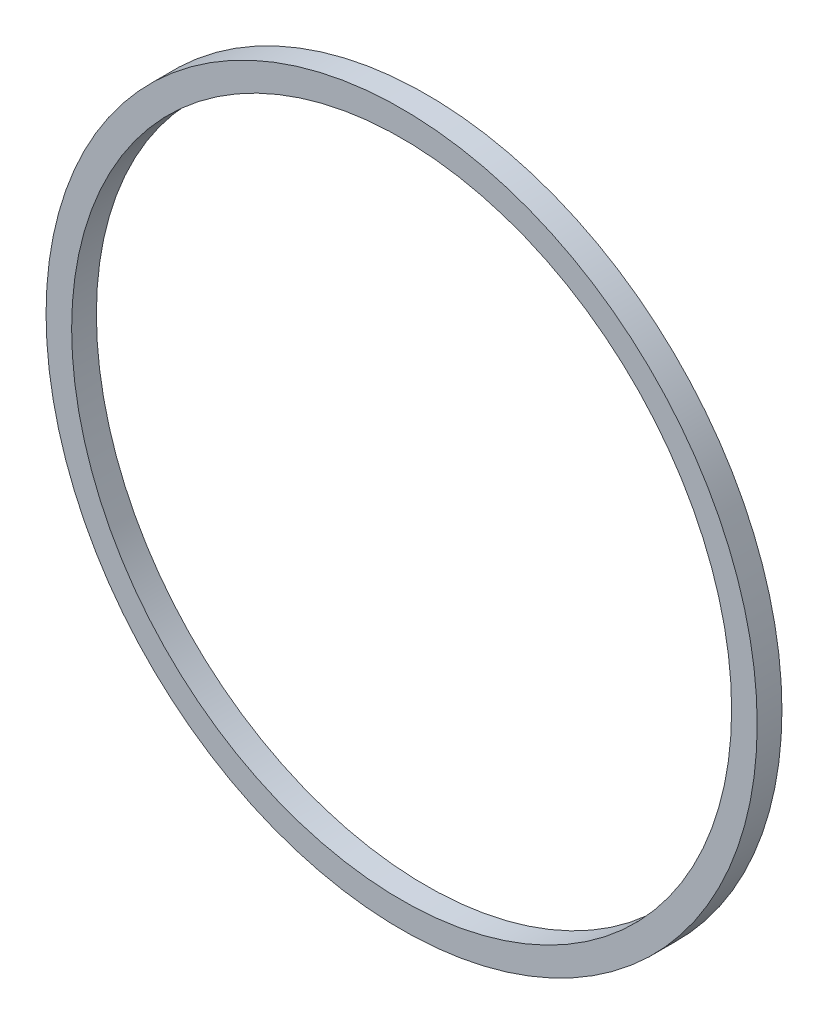
ISO-10303-21;
HEADER;
FILE_DESCRIPTION(('STEP AP214'),'2;1');
FILE_NAME('part.step','',(''),(''),'','','');
FILE_SCHEMA(('AUTOMOTIVE_DESIGN { 1 0 10303 214 1 1 1 1 }'));
ENDSEC;
DATA;
#1=APPLICATION_CONTEXT('core data for automotive mechanical design processes');
#2=APPLICATION_PROTOCOL_DEFINITION('international standard','automotive_design',2000,#1);
#3=PRODUCT_CONTEXT('',#1,'mechanical');
#4=PRODUCT('Part','Part','',(#3));
#5=PRODUCT_RELATED_PRODUCT_CATEGORY('part','',(#4));
#6=PRODUCT_DEFINITION_FORMATION('','',#4);
#7=PRODUCT_DEFINITION_CONTEXT('part definition',#1,'design');
#8=PRODUCT_DEFINITION('design','',#6,#7);
#9=PRODUCT_DEFINITION_SHAPE('','',#8);
#10=(LENGTH_UNIT() NAMED_UNIT(*) SI_UNIT(.MILLI.,.METRE.));
#11=(NAMED_UNIT(*) PLANE_ANGLE_UNIT() SI_UNIT($,.RADIAN.));
#12=(NAMED_UNIT(*) SI_UNIT($,.STERADIAN.) SOLID_ANGLE_UNIT());
#13=UNCERTAINTY_MEASURE_WITH_UNIT(LENGTH_MEASURE(1.E-05),#10,'distance_accuracy_value','');
#14=(GEOMETRIC_REPRESENTATION_CONTEXT(3) GLOBAL_UNCERTAINTY_ASSIGNED_CONTEXT((#13)) GLOBAL_UNIT_ASSIGNED_CONTEXT((#10,
#11,#12)) REPRESENTATION_CONTEXT('',''));
#15=CARTESIAN_POINT('',(0.,0.,0.));
#16=DIRECTION('',(0.,0.,1.));
#17=DIRECTION('',(1.,0.,0.));
#18=AXIS2_PLACEMENT_3D('',#15,#16,#17);
#19=CARTESIAN_POINT('',(0.,0.,76.2));
#20=DIRECTION('',(0.,0.,1.));
#21=DIRECTION('',(1.,0.,0.));
#22=AXIS2_PLACEMENT_3D('',#19,#20,#21);
#23=PLANE('',#22);
#24=CARTESIAN_POINT('',(0.,0.,76.2));
#25=DIRECTION('',(0.,0.,1.));
#26=DIRECTION('',(1.,0.,0.));
#27=AXIS2_PLACEMENT_3D('',#24,#25,#26);
#28=CIRCLE('',#27,1094.74);
#29=CARTESIAN_POINT('',(-1094.74,0.,76.2));
#30=VERTEX_POINT('',#29);
#31=EDGE_CURVE('E11',#30,#30,#28,.T.);
#32=ORIENTED_EDGE('',*,*,#31,.T.);
#33=EDGE_LOOP('',(#32));
#34=FACE_BOUND('',#33,.T.);
#35=CARTESIAN_POINT('',(0.,0.,76.2));
#36=DIRECTION('',(0.,0.,1.));
#37=DIRECTION('',(1.,0.,0.));
#38=AXIS2_PLACEMENT_3D('',#35,#36,#37);
#39=CIRCLE('',#38,1016.);
#40=CARTESIAN_POINT('',(-1016.,0.,76.2));
#41=VERTEX_POINT('',#40);
#42=EDGE_CURVE('E62',#41,#41,#39,.T.);
#43=ORIENTED_EDGE('',*,*,#42,.F.);
#44=EDGE_LOOP('',(#43));
#45=FACE_BOUND('',#44,.T.);
#46=ADVANCED_FACE('F47',(#34,#45),#23,.T.);
#47=CARTESIAN_POINT('',(0.,0.,0.));
#48=DIRECTION('',(0.,0.,1.));
#49=DIRECTION('',(1.,0.,0.));
#50=AXIS2_PLACEMENT_3D('',#47,#48,#49);
#51=PLANE('',#50);
#52=CARTESIAN_POINT('',(0.,0.,0.));
#53=DIRECTION('',(0.,0.,1.));
#54=DIRECTION('',(1.,0.,0.));
#55=AXIS2_PLACEMENT_3D('',#52,#53,#54);
#56=CIRCLE('',#55,1094.74);
#57=CARTESIAN_POINT('',(-1094.74,0.,0.));
#58=VERTEX_POINT('',#57);
#59=EDGE_CURVE('E52',#58,#58,#56,.T.);
#60=ORIENTED_EDGE('',*,*,#59,.F.);
#61=EDGE_LOOP('',(#60));
#62=FACE_BOUND('',#61,.T.);
#63=CARTESIAN_POINT('',(0.,0.,0.));
#64=DIRECTION('',(0.,0.,1.));
#65=DIRECTION('',(1.,0.,0.));
#66=AXIS2_PLACEMENT_3D('',#63,#64,#65);
#67=CIRCLE('',#66,1016.);
#68=CARTESIAN_POINT('',(-1016.,0.,0.));
#69=VERTEX_POINT('',#68);
#70=EDGE_CURVE('E63',#69,#69,#67,.T.);
#71=ORIENTED_EDGE('',*,*,#70,.T.);
#72=EDGE_LOOP('',(#71));
#73=FACE_BOUND('',#72,.T.);
#74=ADVANCED_FACE('F78',(#62,#73),#51,.F.);
#75=CARTESIAN_POINT('',(0.,0.,76.2));
#76=DIRECTION('',(0.,0.,-1.));
#77=DIRECTION('',(-1.,0.,0.));
#78=AXIS2_PLACEMENT_3D('',#75,#76,#77);
#79=CYLINDRICAL_SURFACE('',#78,1094.74);
#80=CARTESIAN_POINT('',(-1094.74,0.,76.2));
#81=CARTESIAN_POINT('',(-1094.74,0.,75.40625));
#82=CARTESIAN_POINT('',(-1094.74,0.,74.6125));
#83=CARTESIAN_POINT('',(-1094.74,0.,73.025));
#84=CARTESIAN_POINT('',(-1094.74,0.,72.23125));
#85=CARTESIAN_POINT('',(-1094.74,0.,70.64375));
#86=CARTESIAN_POINT('',(-1094.74,0.,69.85));
#87=CARTESIAN_POINT('',(-1094.74,0.,68.2625));
#88=CARTESIAN_POINT('',(-1094.74,0.,67.46875));
#89=CARTESIAN_POINT('',(-1094.74,0.,65.88125));
#90=CARTESIAN_POINT('',(-1094.74,0.,65.0875));
#91=CARTESIAN_POINT('',(-1094.74,0.,63.5));
#92=CARTESIAN_POINT('',(-1094.74,0.,62.70625));
#93=CARTESIAN_POINT('',(-1094.74,0.,61.11875));
#94=CARTESIAN_POINT('',(-1094.74,0.,60.325));
#95=CARTESIAN_POINT('',(-1094.74,0.,58.7375));
#96=CARTESIAN_POINT('',(-1094.74,0.,57.94375));
#97=CARTESIAN_POINT('',(-1094.74,0.,56.35625));
#98=CARTESIAN_POINT('',(-1094.74,0.,55.5625));
#99=CARTESIAN_POINT('',(-1094.74,0.,53.975));
#100=CARTESIAN_POINT('',(-1094.74,0.,53.18125));
#101=CARTESIAN_POINT('',(-1094.74,0.,51.59375));
#102=CARTESIAN_POINT('',(-1094.74,0.,50.8));
#103=CARTESIAN_POINT('',(-1094.74,0.,49.2125));
#104=CARTESIAN_POINT('',(-1094.74,0.,48.41875));
#105=CARTESIAN_POINT('',(-1094.74,0.,46.83125));
#106=CARTESIAN_POINT('',(-1094.74,0.,46.0375));
#107=CARTESIAN_POINT('',(-1094.74,0.,44.45));
#108=CARTESIAN_POINT('',(-1094.74,0.,43.65625));
#109=CARTESIAN_POINT('',(-1094.74,0.,42.06875));
#110=CARTESIAN_POINT('',(-1094.74,0.,41.275));
#111=CARTESIAN_POINT('',(-1094.74,0.,39.6875));
#112=CARTESIAN_POINT('',(-1094.74,0.,38.89375));
#113=CARTESIAN_POINT('',(-1094.74,0.,37.30625));
#114=CARTESIAN_POINT('',(-1094.74,0.,36.5125));
#115=CARTESIAN_POINT('',(-1094.74,0.,34.925));
#116=CARTESIAN_POINT('',(-1094.74,0.,34.13125));
#117=CARTESIAN_POINT('',(-1094.74,0.,32.54375));
#118=CARTESIAN_POINT('',(-1094.74,0.,31.75));
#119=CARTESIAN_POINT('',(-1094.74,0.,30.1625));
#120=CARTESIAN_POINT('',(-1094.74,0.,29.36875));
#121=CARTESIAN_POINT('',(-1094.74,0.,27.78125));
#122=CARTESIAN_POINT('',(-1094.74,0.,26.9875));
#123=CARTESIAN_POINT('',(-1094.74,0.,25.4));
#124=CARTESIAN_POINT('',(-1094.74,0.,24.60625));
#125=CARTESIAN_POINT('',(-1094.74,0.,23.01875));
#126=CARTESIAN_POINT('',(-1094.74,0.,22.225));
#127=CARTESIAN_POINT('',(-1094.74,0.,20.6375));
#128=CARTESIAN_POINT('',(-1094.74,0.,19.84375));
#129=CARTESIAN_POINT('',(-1094.74,0.,18.25625));
#130=CARTESIAN_POINT('',(-1094.74,0.,17.4625));
#131=CARTESIAN_POINT('',(-1094.74,0.,15.875));
#132=CARTESIAN_POINT('',(-1094.74,0.,15.08125));
#133=CARTESIAN_POINT('',(-1094.74,0.,13.49375));
#134=CARTESIAN_POINT('',(-1094.74,0.,12.7));
#135=CARTESIAN_POINT('',(-1094.74,0.,11.1125));
#136=CARTESIAN_POINT('',(-1094.74,0.,10.31875));
#137=CARTESIAN_POINT('',(-1094.74,0.,8.73125));
#138=CARTESIAN_POINT('',(-1094.74,0.,7.93750000000001));
#139=CARTESIAN_POINT('',(-1094.74,0.,6.35));
#140=CARTESIAN_POINT('',(-1094.74,0.,5.55625));
#141=CARTESIAN_POINT('',(-1094.74,0.,3.96875));
#142=CARTESIAN_POINT('',(-1094.74,0.,3.175));
#143=CARTESIAN_POINT('',(-1094.74,0.,1.5875));
#144=CARTESIAN_POINT('',(-1094.74,0.,0.793750000000001));
#145=CARTESIAN_POINT('',(-1094.74,0.,0.));
#146=B_SPLINE_CURVE_WITH_KNOTS('',3,(#80,#81,#82,#83,#84,#85,#86,#87,#88,#89,#90,#91,#92,#93,
#94,#95,#96,#97,#98,#99,#100,#101,#102,#103,#104,#105,#106,#107,#108,#109,#110,#111,#112,#113,
#114,#115,#116,#117,#118,#119,#120,#121,#122,#123,#124,#125,#126,#127,#128,#129,#130,#131,#132,
#133,#134,#135,#136,#137,#138,#139,#140,#141,#142,#143,#144,#145),.UNSPECIFIED.,.F.,.F.,(4,2,2,
2,2,2,2,2,2,2,2,2,2,2,2,2,2,2,2,2,2,2,2,2,2,2,2,2,2,2,2,2,4),(0.,2.38125,4.7625,7.14375,
9.52500000000001,11.90625,14.2875,16.66875,19.05,21.43125,23.8125,26.19375,28.575,30.95625,
33.3375,35.71875,38.1,40.48125,42.8625,45.24375,47.625,50.00625,52.3875,54.76875,57.15,59.53125,
61.9125,64.29375,66.675,69.05625,71.4375,73.81875,76.2),.UNSPECIFIED.);
#147=EDGE_CURVE('BSEAM51',#30,#58,#146,.T.);
#148=ORIENTED_EDGE('',*,*,#31,.F.);
#149=ORIENTED_EDGE('',*,*,#59,.T.);
#150=ORIENTED_EDGE('',*,*,#147,.T.);
#151=ORIENTED_EDGE('',*,*,#147,.F.);
#152=EDGE_LOOP('',(#148,#150,#149,#151));
#153=FACE_BOUND('',#152,.T.);
#154=ADVANCED_FACE('F51',(#153),#79,.T.);
#155=CARTESIAN_POINT('',(0.,0.,76.2));
#156=DIRECTION('',(0.,0.,-1.));
#157=DIRECTION('',(-1.,0.,0.));
#158=AXIS2_PLACEMENT_3D('',#155,#156,#157);
#159=CYLINDRICAL_SURFACE('',#158,1016.);
#160=CARTESIAN_POINT('',(-1016.,0.,76.2));
#161=CARTESIAN_POINT('',(-1016.,0.,75.40625));
#162=CARTESIAN_POINT('',(-1016.,0.,74.6125));
#163=CARTESIAN_POINT('',(-1016.,0.,73.025));
#164=CARTESIAN_POINT('',(-1016.,0.,72.23125));
#165=CARTESIAN_POINT('',(-1016.,0.,70.64375));
#166=CARTESIAN_POINT('',(-1016.,0.,69.85));
#167=CARTESIAN_POINT('',(-1016.,0.,68.2625));
#168=CARTESIAN_POINT('',(-1016.,0.,67.46875));
#169=CARTESIAN_POINT('',(-1016.,0.,65.88125));
#170=CARTESIAN_POINT('',(-1016.,0.,65.0875));
#171=CARTESIAN_POINT('',(-1016.,0.,63.5));
#172=CARTESIAN_POINT('',(-1016.,0.,62.70625));
#173=CARTESIAN_POINT('',(-1016.,0.,61.11875));
#174=CARTESIAN_POINT('',(-1016.,0.,60.325));
#175=CARTESIAN_POINT('',(-1016.,0.,58.7375));
#176=CARTESIAN_POINT('',(-1016.,0.,57.94375));
#177=CARTESIAN_POINT('',(-1016.,0.,56.35625));
#178=CARTESIAN_POINT('',(-1016.,0.,55.5625));
#179=CARTESIAN_POINT('',(-1016.,0.,53.975));
#180=CARTESIAN_POINT('',(-1016.,0.,53.18125));
#181=CARTESIAN_POINT('',(-1016.,0.,51.59375));
#182=CARTESIAN_POINT('',(-1016.,0.,50.8));
#183=CARTESIAN_POINT('',(-1016.,0.,49.2125));
#184=CARTESIAN_POINT('',(-1016.,0.,48.41875));
#185=CARTESIAN_POINT('',(-1016.,0.,46.83125));
#186=CARTESIAN_POINT('',(-1016.,0.,46.0375));
#187=CARTESIAN_POINT('',(-1016.,0.,44.45));
#188=CARTESIAN_POINT('',(-1016.,0.,43.65625));
#189=CARTESIAN_POINT('',(-1016.,0.,42.06875));
#190=CARTESIAN_POINT('',(-1016.,0.,41.275));
#191=CARTESIAN_POINT('',(-1016.,0.,39.6875));
#192=CARTESIAN_POINT('',(-1016.,0.,38.89375));
#193=CARTESIAN_POINT('',(-1016.,0.,37.30625));
#194=CARTESIAN_POINT('',(-1016.,0.,36.5125));
#195=CARTESIAN_POINT('',(-1016.,0.,34.925));
#196=CARTESIAN_POINT('',(-1016.,0.,34.13125));
#197=CARTESIAN_POINT('',(-1016.,0.,32.54375));
#198=CARTESIAN_POINT('',(-1016.,0.,31.75));
#199=CARTESIAN_POINT('',(-1016.,0.,30.1625));
#200=CARTESIAN_POINT('',(-1016.,0.,29.36875));
#201=CARTESIAN_POINT('',(-1016.,0.,27.78125));
#202=CARTESIAN_POINT('',(-1016.,0.,26.9875));
#203=CARTESIAN_POINT('',(-1016.,0.,25.4));
#204=CARTESIAN_POINT('',(-1016.,0.,24.60625));
#205=CARTESIAN_POINT('',(-1016.,0.,23.01875));
#206=CARTESIAN_POINT('',(-1016.,0.,22.225));
#207=CARTESIAN_POINT('',(-1016.,0.,20.6375));
#208=CARTESIAN_POINT('',(-1016.,0.,19.84375));
#209=CARTESIAN_POINT('',(-1016.,0.,18.25625));
#210=CARTESIAN_POINT('',(-1016.,0.,17.4625));
#211=CARTESIAN_POINT('',(-1016.,0.,15.875));
#212=CARTESIAN_POINT('',(-1016.,0.,15.08125));
#213=CARTESIAN_POINT('',(-1016.,0.,13.49375));
#214=CARTESIAN_POINT('',(-1016.,0.,12.7));
#215=CARTESIAN_POINT('',(-1016.,0.,11.1125));
#216=CARTESIAN_POINT('',(-1016.,0.,10.31875));
#217=CARTESIAN_POINT('',(-1016.,0.,8.73125));
#218=CARTESIAN_POINT('',(-1016.,0.,7.93750000000001));
#219=CARTESIAN_POINT('',(-1016.,0.,6.35));
#220=CARTESIAN_POINT('',(-1016.,0.,5.55625));
#221=CARTESIAN_POINT('',(-1016.,0.,3.96875));
#222=CARTESIAN_POINT('',(-1016.,0.,3.175));
#223=CARTESIAN_POINT('',(-1016.,0.,1.5875));
#224=CARTESIAN_POINT('',(-1016.,0.,0.793750000000001));
#225=CARTESIAN_POINT('',(-1016.,0.,0.));
#226=B_SPLINE_CURVE_WITH_KNOTS('',3,(#160,#161,#162,#163,#164,#165,#166,#167,#168,#169,#170,
#171,#172,#173,#174,#175,#176,#177,#178,#179,#180,#181,#182,#183,#184,#185,#186,#187,#188,#189,
#190,#191,#192,#193,#194,#195,#196,#197,#198,#199,#200,#201,#202,#203,#204,#205,#206,#207,#208,
#209,#210,#211,#212,#213,#214,#215,#216,#217,#218,#219,#220,#221,#222,#223,#224,#225),
.UNSPECIFIED.,.F.,.F.,(4,2,2,2,2,2,2,2,2,2,2,2,2,2,2,2,2,2,2,2,2,2,2,2,2,2,2,2,2,2,2,2,4),(0.,
2.38125,4.7625,7.14375,9.52500000000001,11.90625,14.2875,16.66875,19.05,21.43125,23.8125,
26.19375,28.575,30.95625,33.3375,35.71875,38.1,40.48125,42.8625,45.24375,47.625,50.00625,
52.3875,54.76875,57.15,59.53125,61.9125,64.29375,66.675,69.05625,71.4375,73.81875,76.2),.UNSPECIFIED.);
#227=EDGE_CURVE('BSEAM72',#41,#69,#226,.T.);
#228=ORIENTED_EDGE('',*,*,#42,.T.);
#229=ORIENTED_EDGE('',*,*,#70,.F.);
#230=ORIENTED_EDGE('',*,*,#227,.T.);
#231=ORIENTED_EDGE('',*,*,#227,.F.);
#232=EDGE_LOOP('',(#228,#230,#229,#231));
#233=FACE_BOUND('',#232,.T.);
#234=ADVANCED_FACE('F72',(#233),#159,.F.);
#235=CLOSED_SHELL('',(#46,#74,#154,#234));
#236=MANIFOLD_SOLID_BREP('B2',#235);
#237=ADVANCED_BREP_SHAPE_REPRESENTATION('',(#18,#236),#14);
#238=SHAPE_DEFINITION_REPRESENTATION(#9,#237);
ENDSEC;
END-ISO-10303-21;
